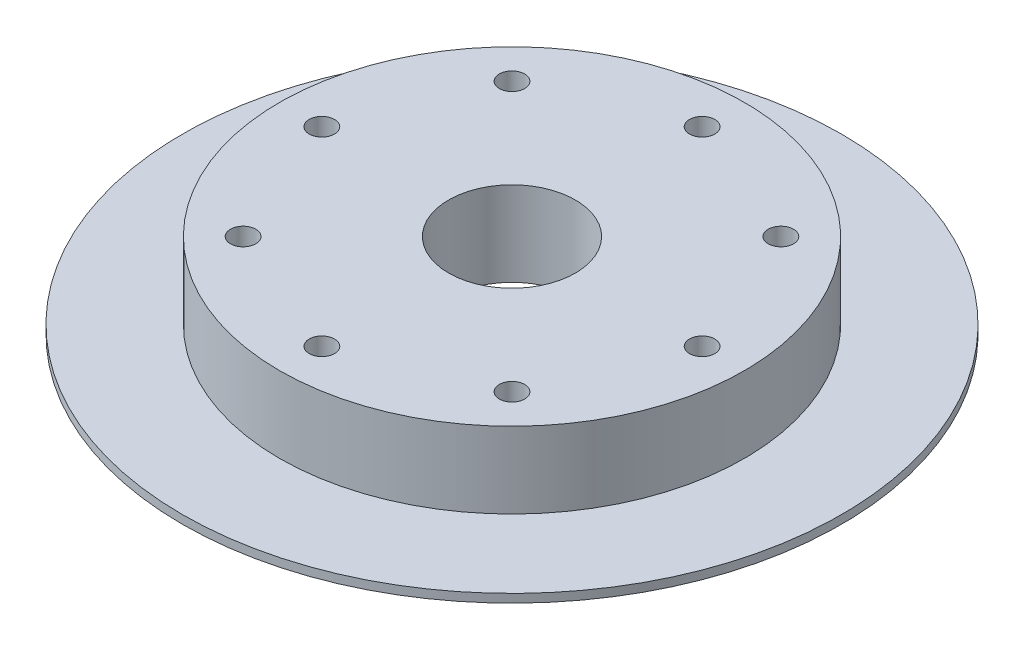
ISO-10303-21;
HEADER;
FILE_DESCRIPTION(('STEP AP214'),'2;1');
FILE_NAME('part.step','',(''),(''),'','','');
FILE_SCHEMA(('AUTOMOTIVE_DESIGN { 1 0 10303 214 1 1 1 1 }'));
ENDSEC;
DATA;
#1=APPLICATION_CONTEXT('core data for automotive mechanical design processes');
#2=APPLICATION_PROTOCOL_DEFINITION('international standard','automotive_design',2000,#1);
#3=PRODUCT_CONTEXT('',#1,'mechanical');
#4=PRODUCT('Part','Part','',(#3));
#5=PRODUCT_RELATED_PRODUCT_CATEGORY('part','',(#4));
#6=PRODUCT_DEFINITION_FORMATION('','',#4);
#7=PRODUCT_DEFINITION_CONTEXT('part definition',#1,'design');
#8=PRODUCT_DEFINITION('design','',#6,#7);
#9=PRODUCT_DEFINITION_SHAPE('','',#8);
#10=(LENGTH_UNIT() NAMED_UNIT(*) SI_UNIT(.MILLI.,.METRE.));
#11=(NAMED_UNIT(*) PLANE_ANGLE_UNIT() SI_UNIT($,.RADIAN.));
#12=(NAMED_UNIT(*) SI_UNIT($,.STERADIAN.) SOLID_ANGLE_UNIT());
#13=UNCERTAINTY_MEASURE_WITH_UNIT(LENGTH_MEASURE(1.E-05),#10,'distance_accuracy_value','');
#14=(GEOMETRIC_REPRESENTATION_CONTEXT(3) GLOBAL_UNCERTAINTY_ASSIGNED_CONTEXT((#13)) GLOBAL_UNIT_ASSIGNED_CONTEXT((#10,
#11,#12)) REPRESENTATION_CONTEXT('',''));
#15=CARTESIAN_POINT('',(0.,0.,0.));
#16=DIRECTION('',(0.,0.,1.));
#17=DIRECTION('',(1.,0.,0.));
#18=AXIS2_PLACEMENT_3D('',#15,#16,#17);
#19=CARTESIAN_POINT('',(15.9099025766973,-1.,-15.9099025766973));
#20=DIRECTION('',(0.,1.,0.));
#21=DIRECTION('',(0.,0.,1.));
#22=AXIS2_PLACEMENT_3D('',#19,#20,#21);
#23=CYLINDRICAL_SURFACE('',#22,1.5);
#24=CARTESIAN_POINT('',(15.9099025766973,-1.,-15.9099025766973));
#25=DIRECTION('',(0.,1.,0.));
#26=DIRECTION('',(0.,0.,1.));
#27=AXIS2_PLACEMENT_3D('',#24,#25,#26);
#28=CIRCLE('',#27,1.5);
#29=CARTESIAN_POINT('',(15.9099025766973,-1.,-14.4099025766973));
#30=VERTEX_POINT('',#29);
#31=EDGE_CURVE('E54',#30,#30,#28,.T.);
#32=ORIENTED_EDGE('',*,*,#31,.F.);
#33=EDGE_LOOP('',(#32));
#34=FACE_BOUND('',#33,.T.);
#35=CARTESIAN_POINT('',(15.9099025766973,9.,-15.9099025766973));
#36=DIRECTION('',(0.,1.,0.));
#37=DIRECTION('',(0.,0.,1.));
#38=AXIS2_PLACEMENT_3D('',#35,#36,#37);
#39=CIRCLE('',#38,1.5);
#40=CARTESIAN_POINT('',(15.9099025766973,9.,-14.4099025766973));
#41=VERTEX_POINT('',#40);
#42=EDGE_CURVE('E95',#41,#41,#39,.T.);
#43=ORIENTED_EDGE('',*,*,#42,.T.);
#44=EDGE_LOOP('',(#43));
#45=FACE_BOUND('',#44,.T.);
#46=ADVANCED_FACE('F41',(#34,#45),#23,.F.);
#47=CARTESIAN_POINT('',(0.,-1.,-22.5));
#48=DIRECTION('',(0.,1.,0.));
#49=DIRECTION('',(0.,0.,1.));
#50=AXIS2_PLACEMENT_3D('',#47,#48,#49);
#51=CYLINDRICAL_SURFACE('',#50,1.5);
#52=CARTESIAN_POINT('',(0.,-1.,-22.5));
#53=DIRECTION('',(0.,1.,0.));
#54=DIRECTION('',(0.,0.,1.));
#55=AXIS2_PLACEMENT_3D('',#52,#53,#54);
#56=CIRCLE('',#55,1.5);
#57=CARTESIAN_POINT('',(0.,-1.,-21.));
#58=VERTEX_POINT('',#57);
#59=EDGE_CURVE('E80',#58,#58,#56,.T.);
#60=ORIENTED_EDGE('',*,*,#59,.F.);
#61=EDGE_LOOP('',(#60));
#62=FACE_BOUND('',#61,.T.);
#63=CARTESIAN_POINT('',(0.,9.,-22.5));
#64=DIRECTION('',(0.,1.,0.));
#65=DIRECTION('',(0.,0.,1.));
#66=AXIS2_PLACEMENT_3D('',#63,#64,#65);
#67=CIRCLE('',#66,1.5);
#68=CARTESIAN_POINT('',(0.,9.,-21.));
#69=VERTEX_POINT('',#68);
#70=EDGE_CURVE('E98',#69,#69,#67,.T.);
#71=ORIENTED_EDGE('',*,*,#70,.T.);
#72=EDGE_LOOP('',(#71));
#73=FACE_BOUND('',#72,.T.);
#74=ADVANCED_FACE('F91',(#62,#73),#51,.F.);
#75=CARTESIAN_POINT('',(-15.9099025766973,-1.,-15.9099025766973));
#76=DIRECTION('',(0.,1.,0.));
#77=DIRECTION('',(0.,0.,1.));
#78=AXIS2_PLACEMENT_3D('',#75,#76,#77);
#79=CYLINDRICAL_SURFACE('',#78,1.5);
#80=CARTESIAN_POINT('',(-15.9099025766973,-1.,-15.9099025766973));
#81=DIRECTION('',(0.,1.,0.));
#82=DIRECTION('',(0.,0.,1.));
#83=AXIS2_PLACEMENT_3D('',#80,#81,#82);
#84=CIRCLE('',#83,1.5);
#85=CARTESIAN_POINT('',(-15.9099025766973,-1.,-14.4099025766973));
#86=VERTEX_POINT('',#85);
#87=EDGE_CURVE('E77',#86,#86,#84,.T.);
#88=ORIENTED_EDGE('',*,*,#87,.F.);
#89=EDGE_LOOP('',(#88));
#90=FACE_BOUND('',#89,.T.);
#91=CARTESIAN_POINT('',(-15.9099025766973,9.,-15.9099025766973));
#92=DIRECTION('',(0.,1.,0.));
#93=DIRECTION('',(0.,0.,1.));
#94=AXIS2_PLACEMENT_3D('',#91,#92,#93);
#95=CIRCLE('',#94,1.5);
#96=CARTESIAN_POINT('',(-15.9099025766973,9.,-14.4099025766973));
#97=VERTEX_POINT('',#96);
#98=EDGE_CURVE('E102',#97,#97,#95,.T.);
#99=ORIENTED_EDGE('',*,*,#98,.T.);
#100=EDGE_LOOP('',(#99));
#101=FACE_BOUND('',#100,.T.);
#102=ADVANCED_FACE('F184',(#90,#101),#79,.F.);
#103=CARTESIAN_POINT('',(-22.5,-1.,0.));
#104=DIRECTION('',(0.,1.,0.));
#105=DIRECTION('',(0.,0.,1.));
#106=AXIS2_PLACEMENT_3D('',#103,#104,#105);
#107=CYLINDRICAL_SURFACE('',#106,1.5);
#108=CARTESIAN_POINT('',(-22.5,-1.,0.));
#109=DIRECTION('',(0.,1.,0.));
#110=DIRECTION('',(0.,0.,1.));
#111=AXIS2_PLACEMENT_3D('',#108,#109,#110);
#112=CIRCLE('',#111,1.5);
#113=CARTESIAN_POINT('',(-22.5,-1.,1.5));
#114=VERTEX_POINT('',#113);
#115=EDGE_CURVE('E74',#114,#114,#112,.T.);
#116=ORIENTED_EDGE('',*,*,#115,.F.);
#117=EDGE_LOOP('',(#116));
#118=FACE_BOUND('',#117,.T.);
#119=CARTESIAN_POINT('',(-22.5,9.,0.));
#120=DIRECTION('',(0.,1.,0.));
#121=DIRECTION('',(0.,0.,1.));
#122=AXIS2_PLACEMENT_3D('',#119,#120,#121);
#123=CIRCLE('',#122,1.5);
#124=CARTESIAN_POINT('',(-22.5,9.,1.5));
#125=VERTEX_POINT('',#124);
#126=EDGE_CURVE('E107',#125,#125,#123,.T.);
#127=ORIENTED_EDGE('',*,*,#126,.T.);
#128=EDGE_LOOP('',(#127));
#129=FACE_BOUND('',#128,.T.);
#130=ADVANCED_FACE('F189',(#118,#129),#107,.F.);
#131=CARTESIAN_POINT('',(-15.9099025766973,-1.,15.9099025766973));
#132=DIRECTION('',(0.,1.,0.));
#133=DIRECTION('',(0.,0.,1.));
#134=AXIS2_PLACEMENT_3D('',#131,#132,#133);
#135=CYLINDRICAL_SURFACE('',#134,1.5);
#136=CARTESIAN_POINT('',(-15.9099025766973,-1.,15.9099025766973));
#137=DIRECTION('',(0.,1.,0.));
#138=DIRECTION('',(0.,0.,1.));
#139=AXIS2_PLACEMENT_3D('',#136,#137,#138);
#140=CIRCLE('',#139,1.5);
#141=CARTESIAN_POINT('',(-15.9099025766973,-1.,17.4099025766973));
#142=VERTEX_POINT('',#141);
#143=EDGE_CURVE('E71',#142,#142,#140,.T.);
#144=ORIENTED_EDGE('',*,*,#143,.F.);
#145=EDGE_LOOP('',(#144));
#146=FACE_BOUND('',#145,.T.);
#147=CARTESIAN_POINT('',(-15.9099025766973,9.,15.9099025766973));
#148=DIRECTION('',(0.,1.,0.));
#149=DIRECTION('',(0.,0.,1.));
#150=AXIS2_PLACEMENT_3D('',#147,#148,#149);
#151=CIRCLE('',#150,1.5);
#152=CARTESIAN_POINT('',(-15.9099025766973,9.,17.4099025766973));
#153=VERTEX_POINT('',#152);
#154=EDGE_CURVE('E110',#153,#153,#151,.T.);
#155=ORIENTED_EDGE('',*,*,#154,.T.);
#156=EDGE_LOOP('',(#155));
#157=FACE_BOUND('',#156,.T.);
#158=ADVANCED_FACE('F195',(#146,#157),#135,.F.);
#159=CARTESIAN_POINT('',(0.,-1.,22.5));
#160=DIRECTION('',(0.,1.,0.));
#161=DIRECTION('',(0.,0.,1.));
#162=AXIS2_PLACEMENT_3D('',#159,#160,#161);
#163=CYLINDRICAL_SURFACE('',#162,1.5);
#164=CARTESIAN_POINT('',(0.,-1.,22.5));
#165=DIRECTION('',(0.,1.,0.));
#166=DIRECTION('',(0.,0.,1.));
#167=AXIS2_PLACEMENT_3D('',#164,#165,#166);
#168=CIRCLE('',#167,1.5);
#169=CARTESIAN_POINT('',(0.,-1.,24.));
#170=VERTEX_POINT('',#169);
#171=EDGE_CURVE('E68',#170,#170,#168,.T.);
#172=ORIENTED_EDGE('',*,*,#171,.F.);
#173=EDGE_LOOP('',(#172));
#174=FACE_BOUND('',#173,.T.);
#175=CARTESIAN_POINT('',(0.,9.,22.5));
#176=DIRECTION('',(0.,1.,0.));
#177=DIRECTION('',(0.,0.,1.));
#178=AXIS2_PLACEMENT_3D('',#175,#176,#177);
#179=CIRCLE('',#178,1.5);
#180=CARTESIAN_POINT('',(0.,9.,24.));
#181=VERTEX_POINT('',#180);
#182=EDGE_CURVE('E113',#181,#181,#179,.T.);
#183=ORIENTED_EDGE('',*,*,#182,.T.);
#184=EDGE_LOOP('',(#183));
#185=FACE_BOUND('',#184,.T.);
#186=ADVANCED_FACE('F199',(#174,#185),#163,.F.);
#187=CARTESIAN_POINT('',(15.9099025766973,-1.,15.9099025766973));
#188=DIRECTION('',(0.,1.,0.));
#189=DIRECTION('',(0.,0.,1.));
#190=AXIS2_PLACEMENT_3D('',#187,#188,#189);
#191=CYLINDRICAL_SURFACE('',#190,1.5);
#192=CARTESIAN_POINT('',(15.9099025766973,-1.,15.9099025766973));
#193=DIRECTION('',(0.,1.,0.));
#194=DIRECTION('',(0.,0.,1.));
#195=AXIS2_PLACEMENT_3D('',#192,#193,#194);
#196=CIRCLE('',#195,1.5);
#197=CARTESIAN_POINT('',(15.9099025766973,-1.,17.4099025766973));
#198=VERTEX_POINT('',#197);
#199=EDGE_CURVE('E65',#198,#198,#196,.T.);
#200=ORIENTED_EDGE('',*,*,#199,.F.);
#201=EDGE_LOOP('',(#200));
#202=FACE_BOUND('',#201,.T.);
#203=CARTESIAN_POINT('',(15.9099025766973,9.,15.9099025766973));
#204=DIRECTION('',(0.,1.,0.));
#205=DIRECTION('',(0.,0.,1.));
#206=AXIS2_PLACEMENT_3D('',#203,#204,#205);
#207=CIRCLE('',#206,1.5);
#208=CARTESIAN_POINT('',(15.9099025766973,9.,17.4099025766973));
#209=VERTEX_POINT('',#208);
#210=EDGE_CURVE('E116',#209,#209,#207,.T.);
#211=ORIENTED_EDGE('',*,*,#210,.T.);
#212=EDGE_LOOP('',(#211));
#213=FACE_BOUND('',#212,.T.);
#214=ADVANCED_FACE('F161',(#202,#213),#191,.F.);
#215=CARTESIAN_POINT('',(22.5,-1.,0.));
#216=DIRECTION('',(0.,1.,0.));
#217=DIRECTION('',(0.,0.,1.));
#218=AXIS2_PLACEMENT_3D('',#215,#216,#217);
#219=CYLINDRICAL_SURFACE('',#218,1.5);
#220=CARTESIAN_POINT('',(22.5,-1.,0.));
#221=DIRECTION('',(0.,1.,0.));
#222=DIRECTION('',(0.,0.,1.));
#223=AXIS2_PLACEMENT_3D('',#220,#221,#222);
#224=CIRCLE('',#223,1.5);
#225=CARTESIAN_POINT('',(22.5,-1.,1.5));
#226=VERTEX_POINT('',#225);
#227=EDGE_CURVE('E62',#226,#226,#224,.T.);
#228=ORIENTED_EDGE('',*,*,#227,.F.);
#229=EDGE_LOOP('',(#228));
#230=FACE_BOUND('',#229,.T.);
#231=CARTESIAN_POINT('',(22.5,9.,0.));
#232=DIRECTION('',(0.,1.,0.));
#233=DIRECTION('',(0.,0.,1.));
#234=AXIS2_PLACEMENT_3D('',#231,#232,#233);
#235=CIRCLE('',#234,1.5);
#236=CARTESIAN_POINT('',(22.5,9.,1.5));
#237=VERTEX_POINT('',#236);
#238=EDGE_CURVE('E119',#237,#237,#235,.T.);
#239=ORIENTED_EDGE('',*,*,#238,.T.);
#240=EDGE_LOOP('',(#239));
#241=FACE_BOUND('',#240,.T.);
#242=ADVANCED_FACE('F123',(#230,#241),#219,.F.);
#243=CARTESIAN_POINT('',(0.,-1.,0.));
#244=DIRECTION('',(0.,1.,0.));
#245=DIRECTION('',(0.,0.,1.));
#246=AXIS2_PLACEMENT_3D('',#243,#244,#245);
#247=CYLINDRICAL_SURFACE('',#246,39.);
#248=CARTESIAN_POINT('',(0.,-1.,0.));
#249=DIRECTION('',(0.,1.,0.));
#250=DIRECTION('',(0.,0.,1.));
#251=AXIS2_PLACEMENT_3D('',#248,#249,#250);
#252=CIRCLE('',#251,39.);
#253=CARTESIAN_POINT('',(0.,-1.,39.));
#254=VERTEX_POINT('',#253);
#255=EDGE_CURVE('E59',#254,#254,#252,.T.);
#256=ORIENTED_EDGE('',*,*,#255,.T.);
#257=EDGE_LOOP('',(#256));
#258=FACE_BOUND('',#257,.T.);
#259=CARTESIAN_POINT('',(0.,0.,0.));
#260=DIRECTION('',(0.,1.,0.));
#261=DIRECTION('',(0.,0.,1.));
#262=AXIS2_PLACEMENT_3D('',#259,#260,#261);
#263=CIRCLE('',#262,39.);
#264=CARTESIAN_POINT('',(0.,0.,39.));
#265=VERTEX_POINT('',#264);
#266=EDGE_CURVE('E45',#265,#265,#263,.T.);
#267=ORIENTED_EDGE('',*,*,#266,.F.);
#268=EDGE_LOOP('',(#267));
#269=FACE_BOUND('',#268,.T.);
#270=ADVANCED_FACE('F43',(#258,#269),#247,.T.);
#271=CARTESIAN_POINT('',(0.,-1.,0.));
#272=DIRECTION('',(0.,1.,0.));
#273=DIRECTION('',(0.,0.,1.));
#274=AXIS2_PLACEMENT_3D('',#271,#272,#273);
#275=CYLINDRICAL_SURFACE('',#274,7.5);
#276=CARTESIAN_POINT('',(0.,-1.,0.));
#277=DIRECTION('',(0.,1.,0.));
#278=DIRECTION('',(0.,0.,1.));
#279=AXIS2_PLACEMENT_3D('',#276,#277,#278);
#280=CIRCLE('',#279,7.5);
#281=CARTESIAN_POINT('',(0.,-1.,7.5));
#282=VERTEX_POINT('',#281);
#283=EDGE_CURVE('E49',#282,#282,#280,.T.);
#284=ORIENTED_EDGE('',*,*,#283,.F.);
#285=EDGE_LOOP('',(#284));
#286=FACE_BOUND('',#285,.T.);
#287=CARTESIAN_POINT('',(0.,9.,0.));
#288=DIRECTION('',(0.,1.,0.));
#289=DIRECTION('',(0.,0.,1.));
#290=AXIS2_PLACEMENT_3D('',#287,#288,#289);
#291=CIRCLE('',#290,7.5);
#292=CARTESIAN_POINT('',(0.,9.,7.5));
#293=VERTEX_POINT('',#292);
#294=EDGE_CURVE('E97',#293,#293,#291,.T.);
#295=ORIENTED_EDGE('',*,*,#294,.T.);
#296=EDGE_LOOP('',(#295));
#297=FACE_BOUND('',#296,.T.);
#298=ADVANCED_FACE('F153',(#286,#297),#275,.F.);
#299=CARTESIAN_POINT('',(0.,-1.,0.));
#300=DIRECTION('',(0.,1.,0.));
#301=DIRECTION('',(0.,0.,1.));
#302=AXIS2_PLACEMENT_3D('',#299,#300,#301);
#303=PLANE('',#302);
#304=ORIENTED_EDGE('',*,*,#255,.F.);
#305=EDGE_LOOP('',(#304));
#306=FACE_BOUND('',#305,.T.);
#307=ORIENTED_EDGE('',*,*,#227,.T.);
#308=EDGE_LOOP('',(#307));
#309=FACE_BOUND('',#308,.T.);
#310=ORIENTED_EDGE('',*,*,#199,.T.);
#311=EDGE_LOOP('',(#310));
#312=FACE_BOUND('',#311,.T.);
#313=ORIENTED_EDGE('',*,*,#171,.T.);
#314=EDGE_LOOP('',(#313));
#315=FACE_BOUND('',#314,.T.);
#316=ORIENTED_EDGE('',*,*,#143,.T.);
#317=EDGE_LOOP('',(#316));
#318=FACE_BOUND('',#317,.T.);
#319=ORIENTED_EDGE('',*,*,#115,.T.);
#320=EDGE_LOOP('',(#319));
#321=FACE_BOUND('',#320,.T.);
#322=ORIENTED_EDGE('',*,*,#87,.T.);
#323=EDGE_LOOP('',(#322));
#324=FACE_BOUND('',#323,.T.);
#325=ORIENTED_EDGE('',*,*,#59,.T.);
#326=EDGE_LOOP('',(#325));
#327=FACE_BOUND('',#326,.T.);
#328=ORIENTED_EDGE('',*,*,#31,.T.);
#329=EDGE_LOOP('',(#328));
#330=FACE_BOUND('',#329,.T.);
#331=ORIENTED_EDGE('',*,*,#283,.T.);
#332=EDGE_LOOP('',(#331));
#333=FACE_BOUND('',#332,.T.);
#334=ADVANCED_FACE('F86',(#306,#309,#312,#315,#318,#321,#324,#327,#330,#333),#303,.F.);
#335=CARTESIAN_POINT('',(0.,0.,0.));
#336=DIRECTION('',(0.,1.,0.));
#337=DIRECTION('',(0.,0.,1.));
#338=AXIS2_PLACEMENT_3D('',#335,#336,#337);
#339=PLANE('',#338);
#340=CARTESIAN_POINT('',(0.,0.,0.));
#341=DIRECTION('',(0.,1.,0.));
#342=DIRECTION('',(0.,0.,1.));
#343=AXIS2_PLACEMENT_3D('',#340,#341,#342);
#344=CIRCLE('',#343,27.5);
#345=CARTESIAN_POINT('',(0.,0.,27.5));
#346=VERTEX_POINT('',#345);
#347=EDGE_CURVE('E10',#346,#346,#344,.T.);
#348=ORIENTED_EDGE('',*,*,#347,.F.);
#349=EDGE_LOOP('',(#348));
#350=FACE_BOUND('',#349,.T.);
#351=ORIENTED_EDGE('',*,*,#266,.T.);
#352=EDGE_LOOP('',(#351));
#353=FACE_BOUND('',#352,.T.);
#354=ADVANCED_FACE('F150',(#350,#353),#339,.T.);
#355=CARTESIAN_POINT('',(0.,9.,0.));
#356=DIRECTION('',(0.,-1.,0.));
#357=DIRECTION('',(0.,0.,-1.));
#358=AXIS2_PLACEMENT_3D('',#355,#356,#357);
#359=CYLINDRICAL_SURFACE('',#358,27.5);
#360=CARTESIAN_POINT('',(0.,9.,0.));
#361=DIRECTION('',(0.,1.,0.));
#362=DIRECTION('',(0.,0.,1.));
#363=AXIS2_PLACEMENT_3D('',#360,#361,#362);
#364=CIRCLE('',#363,27.5);
#365=CARTESIAN_POINT('',(0.,9.,27.5));
#366=VERTEX_POINT('',#365);
#367=EDGE_CURVE('E57',#366,#366,#364,.T.);
#368=ORIENTED_EDGE('',*,*,#367,.F.);
#369=EDGE_LOOP('',(#368));
#370=FACE_BOUND('',#369,.T.);
#371=ORIENTED_EDGE('',*,*,#347,.T.);
#372=EDGE_LOOP('',(#371));
#373=FACE_BOUND('',#372,.T.);
#374=ADVANCED_FACE('F128',(#370,#373),#359,.T.);
#375=CARTESIAN_POINT('',(0.,9.,0.));
#376=DIRECTION('',(0.,1.,0.));
#377=DIRECTION('',(0.,0.,1.));
#378=AXIS2_PLACEMENT_3D('',#375,#376,#377);
#379=PLANE('',#378);
#380=ORIENTED_EDGE('',*,*,#238,.F.);
#381=EDGE_LOOP('',(#380));
#382=FACE_BOUND('',#381,.T.);
#383=ORIENTED_EDGE('',*,*,#210,.F.);
#384=EDGE_LOOP('',(#383));
#385=FACE_BOUND('',#384,.T.);
#386=ORIENTED_EDGE('',*,*,#182,.F.);
#387=EDGE_LOOP('',(#386));
#388=FACE_BOUND('',#387,.T.);
#389=ORIENTED_EDGE('',*,*,#154,.F.);
#390=EDGE_LOOP('',(#389));
#391=FACE_BOUND('',#390,.T.);
#392=ORIENTED_EDGE('',*,*,#126,.F.);
#393=EDGE_LOOP('',(#392));
#394=FACE_BOUND('',#393,.T.);
#395=ORIENTED_EDGE('',*,*,#98,.F.);
#396=EDGE_LOOP('',(#395));
#397=FACE_BOUND('',#396,.T.);
#398=ORIENTED_EDGE('',*,*,#70,.F.);
#399=EDGE_LOOP('',(#398));
#400=FACE_BOUND('',#399,.T.);
#401=ORIENTED_EDGE('',*,*,#42,.F.);
#402=EDGE_LOOP('',(#401));
#403=FACE_BOUND('',#402,.T.);
#404=ORIENTED_EDGE('',*,*,#294,.F.);
#405=EDGE_LOOP('',(#404));
#406=FACE_BOUND('',#405,.T.);
#407=ORIENTED_EDGE('',*,*,#367,.T.);
#408=EDGE_LOOP('',(#407));
#409=FACE_BOUND('',#408,.T.);
#410=ADVANCED_FACE('F125',(#382,#385,#388,#391,#394,#397,#400,#403,#406,#409),#379,.T.);
#411=CLOSED_SHELL('',(#46,#74,#102,#130,#158,#186,#214,#242,#270,#298,#334,#354,#374,#410));
#412=MANIFOLD_SOLID_BREP('B2',#411);
#413=ADVANCED_BREP_SHAPE_REPRESENTATION('',(#18,#412),#14);
#414=SHAPE_DEFINITION_REPRESENTATION(#9,#413);
ENDSEC;
END-ISO-10303-21;
